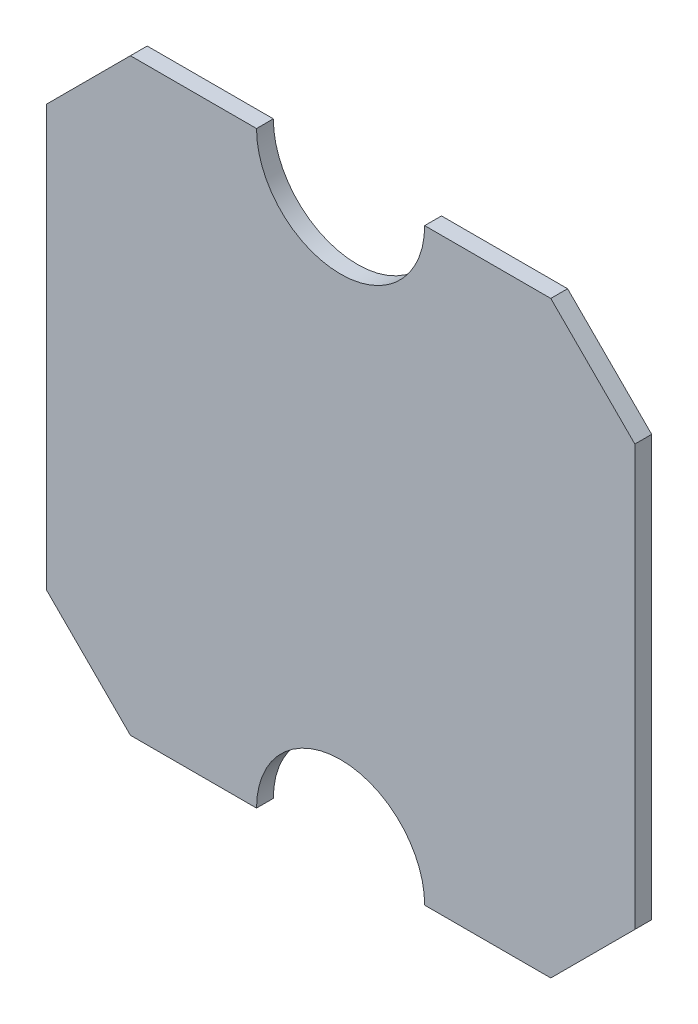
ISO-10303-21;
HEADER;
FILE_DESCRIPTION(('STEP AP214'),'2;1');
FILE_NAME('part.step','',(''),(''),'','','');
FILE_SCHEMA(('AUTOMOTIVE_DESIGN { 1 0 10303 214 1 1 1 1 }'));
ENDSEC;
DATA;
#1=APPLICATION_CONTEXT('core data for automotive mechanical design processes');
#2=APPLICATION_PROTOCOL_DEFINITION('international standard','automotive_design',2000,#1);
#3=PRODUCT_CONTEXT('',#1,'mechanical');
#4=PRODUCT('Part','Part','',(#3));
#5=PRODUCT_RELATED_PRODUCT_CATEGORY('part','',(#4));
#6=PRODUCT_DEFINITION_FORMATION('','',#4);
#7=PRODUCT_DEFINITION_CONTEXT('part definition',#1,'design');
#8=PRODUCT_DEFINITION('design','',#6,#7);
#9=PRODUCT_DEFINITION_SHAPE('','',#8);
#10=(LENGTH_UNIT() NAMED_UNIT(*) SI_UNIT(.MILLI.,.METRE.));
#11=(NAMED_UNIT(*) PLANE_ANGLE_UNIT() SI_UNIT($,.RADIAN.));
#12=(NAMED_UNIT(*) SI_UNIT($,.STERADIAN.) SOLID_ANGLE_UNIT());
#13=UNCERTAINTY_MEASURE_WITH_UNIT(LENGTH_MEASURE(1.E-05),#10,'distance_accuracy_value','');
#14=(GEOMETRIC_REPRESENTATION_CONTEXT(3) GLOBAL_UNCERTAINTY_ASSIGNED_CONTEXT((#13)) GLOBAL_UNIT_ASSIGNED_CONTEXT((#10,
#11,#12)) REPRESENTATION_CONTEXT('',''));
#15=CARTESIAN_POINT('',(0.,0.,0.));
#16=DIRECTION('',(0.,0.,1.));
#17=DIRECTION('',(1.,0.,0.));
#18=AXIS2_PLACEMENT_3D('',#15,#16,#17);
#19=CARTESIAN_POINT('',(-1.17283157399439E-12,175.,10.));
#20=DIRECTION('',(0.,0.,-1.));
#21=DIRECTION('',(-1.,0.,0.));
#22=AXIS2_PLACEMENT_3D('',#19,#20,#21);
#23=CYLINDRICAL_SURFACE('',#22,50.);
#24=CARTESIAN_POINT('',(-1.17283157399439E-12,175.,0.));
#25=DIRECTION('',(0.,0.,1.));
#26=DIRECTION('',(1.,0.,0.));
#27=AXIS2_PLACEMENT_3D('',#24,#25,#26);
#28=CIRCLE('',#27,50.);
#29=CARTESIAN_POINT('',(-50.0000000000012,175.,0.));
#30=VERTEX_POINT('',#29);
#31=CARTESIAN_POINT('',(49.9999999999989,175.,0.));
#32=VERTEX_POINT('',#31);
#33=EDGE_CURVE('E170',#30,#32,#28,.T.);
#34=ORIENTED_EDGE('',*,*,#33,.F.);
#35=DIRECTION('',(0.,0.,-1.));
#36=VECTOR('',#35,1.);
#37=CARTESIAN_POINT('',(-50.0000000000012,175.,10.));
#38=LINE('',#37,#36);
#39=CARTESIAN_POINT('',(-50.0000000000012,175.,10.));
#40=VERTEX_POINT('',#39);
#41=EDGE_CURVE('E11',#40,#30,#38,.T.);
#42=ORIENTED_EDGE('',*,*,#41,.F.);
#43=CARTESIAN_POINT('',(-1.17283157399439E-12,175.,10.));
#44=DIRECTION('',(0.,0.,1.));
#45=DIRECTION('',(1.,0.,0.));
#46=AXIS2_PLACEMENT_3D('',#43,#44,#45);
#47=CIRCLE('',#46,50.);
#48=CARTESIAN_POINT('',(49.9999999999989,175.,10.));
#49=VERTEX_POINT('',#48);
#50=EDGE_CURVE('E258',#40,#49,#47,.T.);
#51=ORIENTED_EDGE('',*,*,#50,.T.);
#52=DIRECTION('',(0.,0.,-1.));
#53=VECTOR('',#52,1.);
#54=CARTESIAN_POINT('',(49.9999999999989,175.,10.));
#55=LINE('',#54,#53);
#56=EDGE_CURVE('E111',#49,#32,#55,.T.);
#57=ORIENTED_EDGE('',*,*,#56,.T.);
#58=EDGE_LOOP('',(#34,#42,#51,#57));
#59=FACE_BOUND('',#58,.T.);
#60=ADVANCED_FACE('F47',(#59),#23,.F.);
#61=CARTESIAN_POINT('',(0.,175.,10.));
#62=DIRECTION('',(0.,-1.,0.));
#63=DIRECTION('',(1.,0.,0.));
#64=AXIS2_PLACEMENT_3D('',#61,#62,#63);
#65=PLANE('',#64);
#66=DIRECTION('',(-1.,0.,0.));
#67=VECTOR('',#66,1.);
#68=CARTESIAN_POINT('',(0.,175.,0.));
#69=LINE('',#68,#67);
#70=CARTESIAN_POINT('',(-125.,175.,0.));
#71=VERTEX_POINT('',#70);
#72=EDGE_CURVE('E174',#30,#71,#69,.T.);
#73=ORIENTED_EDGE('',*,*,#72,.T.);
#74=DIRECTION('',(0.,0.,-1.));
#75=VECTOR('',#74,1.);
#76=CARTESIAN_POINT('',(-125.,175.,10.));
#77=LINE('',#76,#75);
#78=CARTESIAN_POINT('',(-125.,175.,10.));
#79=VERTEX_POINT('',#78);
#80=EDGE_CURVE('E56',#79,#71,#77,.T.);
#81=ORIENTED_EDGE('',*,*,#80,.F.);
#82=DIRECTION('',(-1.,0.,0.));
#83=VECTOR('',#82,1.);
#84=CARTESIAN_POINT('',(0.,175.,10.));
#85=LINE('',#84,#83);
#86=EDGE_CURVE('E167',#40,#79,#85,.T.);
#87=ORIENTED_EDGE('',*,*,#86,.F.);
#88=ORIENTED_EDGE('',*,*,#41,.T.);
#89=EDGE_LOOP('',(#73,#81,#87,#88));
#90=FACE_BOUND('',#89,.T.);
#91=ADVANCED_FACE('F241',(#90),#65,.F.);
#92=CARTESIAN_POINT('',(-150.,150.,10.));
#93=DIRECTION('',(-0.707106781186548,0.707106781186547,0.));
#94=DIRECTION('',(-0.707106781186547,-0.707106781186548,0.));
#95=AXIS2_PLACEMENT_3D('',#92,#93,#94);
#96=PLANE('',#95);
#97=DIRECTION('',(0.707106781186547,0.707106781186548,0.));
#98=VECTOR('',#97,1.);
#99=CARTESIAN_POINT('',(-150.,150.,0.));
#100=LINE('',#99,#98);
#101=CARTESIAN_POINT('',(-175.,125.,0.));
#102=VERTEX_POINT('',#101);
#103=EDGE_CURVE('E178',#102,#71,#100,.T.);
#104=ORIENTED_EDGE('',*,*,#103,.F.);
#105=DIRECTION('',(0.,0.,-1.));
#106=VECTOR('',#105,1.);
#107=CARTESIAN_POINT('',(-175.,125.,10.));
#108=LINE('',#107,#106);
#109=CARTESIAN_POINT('',(-175.,125.,10.));
#110=VERTEX_POINT('',#109);
#111=EDGE_CURVE('E229',#110,#102,#108,.T.);
#112=ORIENTED_EDGE('',*,*,#111,.F.);
#113=DIRECTION('',(0.707106781186547,0.707106781186548,0.));
#114=VECTOR('',#113,1.);
#115=CARTESIAN_POINT('',(-150.,150.,10.));
#116=LINE('',#115,#114);
#117=EDGE_CURVE('E238',#110,#79,#116,.T.);
#118=ORIENTED_EDGE('',*,*,#117,.T.);
#119=ORIENTED_EDGE('',*,*,#80,.T.);
#120=EDGE_LOOP('',(#104,#112,#118,#119));
#121=FACE_BOUND('',#120,.T.);
#122=ADVANCED_FACE('F236',(#121),#96,.T.);
#123=CARTESIAN_POINT('',(-175.,0.,10.));
#124=DIRECTION('',(-1.,0.,0.));
#125=DIRECTION('',(0.,0.,1.));
#126=AXIS2_PLACEMENT_3D('',#123,#124,#125);
#127=PLANE('',#126);
#128=DIRECTION('',(0.,1.,0.));
#129=VECTOR('',#128,1.);
#130=CARTESIAN_POINT('',(-175.,0.,0.));
#131=LINE('',#130,#129);
#132=CARTESIAN_POINT('',(-175.,-125.,0.));
#133=VERTEX_POINT('',#132);
#134=EDGE_CURVE('E183',#133,#102,#131,.T.);
#135=ORIENTED_EDGE('',*,*,#134,.F.);
#136=DIRECTION('',(0.,0.,-1.));
#137=VECTOR('',#136,1.);
#138=CARTESIAN_POINT('',(-175.,-125.,10.));
#139=LINE('',#138,#137);
#140=CARTESIAN_POINT('',(-175.,-125.,10.));
#141=VERTEX_POINT('',#140);
#142=EDGE_CURVE('E226',#141,#133,#139,.T.);
#143=ORIENTED_EDGE('',*,*,#142,.F.);
#144=DIRECTION('',(0.,1.,0.));
#145=VECTOR('',#144,1.);
#146=CARTESIAN_POINT('',(-175.,0.,10.));
#147=LINE('',#146,#145);
#148=EDGE_CURVE('E251',#141,#110,#147,.T.);
#149=ORIENTED_EDGE('',*,*,#148,.T.);
#150=ORIENTED_EDGE('',*,*,#111,.T.);
#151=EDGE_LOOP('',(#135,#143,#149,#150));
#152=FACE_BOUND('',#151,.T.);
#153=ADVANCED_FACE('F247',(#152),#127,.T.);
#154=CARTESIAN_POINT('',(-150.,-150.,10.));
#155=DIRECTION('',(0.707106781186548,0.707106781186547,0.));
#156=DIRECTION('',(-0.707106781186547,0.707106781186548,0.));
#157=AXIS2_PLACEMENT_3D('',#154,#155,#156);
#158=PLANE('',#157);
#159=DIRECTION('',(0.707106781186547,-0.707106781186548,0.));
#160=VECTOR('',#159,1.);
#161=CARTESIAN_POINT('',(-150.,-150.,0.));
#162=LINE('',#161,#160);
#163=CARTESIAN_POINT('',(-125.,-175.,0.));
#164=VERTEX_POINT('',#163);
#165=EDGE_CURVE('E187',#133,#164,#162,.T.);
#166=ORIENTED_EDGE('',*,*,#165,.T.);
#167=DIRECTION('',(0.,0.,-1.));
#168=VECTOR('',#167,1.);
#169=CARTESIAN_POINT('',(-125.,-175.,10.));
#170=LINE('',#169,#168);
#171=CARTESIAN_POINT('',(-125.,-175.,10.));
#172=VERTEX_POINT('',#171);
#173=EDGE_CURVE('E223',#172,#164,#170,.T.);
#174=ORIENTED_EDGE('',*,*,#173,.F.);
#175=DIRECTION('',(0.707106781186547,-0.707106781186548,0.));
#176=VECTOR('',#175,1.);
#177=CARTESIAN_POINT('',(-150.,-150.,10.));
#178=LINE('',#177,#176);
#179=EDGE_CURVE('E256',#141,#172,#178,.T.);
#180=ORIENTED_EDGE('',*,*,#179,.F.);
#181=ORIENTED_EDGE('',*,*,#142,.T.);
#182=EDGE_LOOP('',(#166,#174,#180,#181));
#183=FACE_BOUND('',#182,.T.);
#184=ADVANCED_FACE('F321',(#183),#158,.F.);
#185=CARTESIAN_POINT('',(0.,-175.,10.));
#186=DIRECTION('',(0.,-1.,0.));
#187=DIRECTION('',(1.,0.,0.));
#188=AXIS2_PLACEMENT_3D('',#185,#186,#187);
#189=PLANE('',#188);
#190=DIRECTION('',(-1.,0.,0.));
#191=VECTOR('',#190,1.);
#192=CARTESIAN_POINT('',(0.,-175.,0.));
#193=LINE('',#192,#191);
#194=CARTESIAN_POINT('',(-50.,-175.,0.));
#195=VERTEX_POINT('',#194);
#196=EDGE_CURVE('E191',#195,#164,#193,.T.);
#197=ORIENTED_EDGE('',*,*,#196,.F.);
#198=DIRECTION('',(0.,0.,-1.));
#199=VECTOR('',#198,1.);
#200=CARTESIAN_POINT('',(-50.,-175.,10.));
#201=LINE('',#200,#199);
#202=CARTESIAN_POINT('',(-50.,-175.,10.));
#203=VERTEX_POINT('',#202);
#204=EDGE_CURVE('E220',#203,#195,#201,.T.);
#205=ORIENTED_EDGE('',*,*,#204,.F.);
#206=DIRECTION('',(-1.,0.,0.));
#207=VECTOR('',#206,1.);
#208=CARTESIAN_POINT('',(0.,-175.,10.));
#209=LINE('',#208,#207);
#210=EDGE_CURVE('E263',#203,#172,#209,.T.);
#211=ORIENTED_EDGE('',*,*,#210,.T.);
#212=ORIENTED_EDGE('',*,*,#173,.T.);
#213=EDGE_LOOP('',(#197,#205,#211,#212));
#214=FACE_BOUND('',#213,.T.);
#215=ADVANCED_FACE('F317',(#214),#189,.T.);
#216=CARTESIAN_POINT('',(0.,-175.,10.));
#217=DIRECTION('',(0.,0.,-1.));
#218=DIRECTION('',(-1.,0.,0.));
#219=AXIS2_PLACEMENT_3D('',#216,#217,#218);
#220=CYLINDRICAL_SURFACE('',#219,50.);
#221=CARTESIAN_POINT('',(0.,-175.,0.));
#222=DIRECTION('',(0.,0.,1.));
#223=DIRECTION('',(1.,0.,0.));
#224=AXIS2_PLACEMENT_3D('',#221,#222,#223);
#225=CIRCLE('',#224,50.);
#226=CARTESIAN_POINT('',(50.0000000000001,-175.,0.));
#227=VERTEX_POINT('',#226);
#228=EDGE_CURVE('E195',#195,#227,#225,.F.);
#229=ORIENTED_EDGE('',*,*,#228,.T.);
#230=DIRECTION('',(0.,0.,-1.));
#231=VECTOR('',#230,1.);
#232=CARTESIAN_POINT('',(50.0000000000001,-175.,10.));
#233=LINE('',#232,#231);
#234=CARTESIAN_POINT('',(50.0000000000001,-175.,10.));
#235=VERTEX_POINT('',#234);
#236=EDGE_CURVE('E217',#235,#227,#233,.T.);
#237=ORIENTED_EDGE('',*,*,#236,.F.);
#238=CARTESIAN_POINT('',(0.,-175.,10.));
#239=DIRECTION('',(0.,0.,1.));
#240=DIRECTION('',(1.,0.,0.));
#241=AXIS2_PLACEMENT_3D('',#238,#239,#240);
#242=CIRCLE('',#241,50.);
#243=EDGE_CURVE('E267',#203,#235,#242,.F.);
#244=ORIENTED_EDGE('',*,*,#243,.F.);
#245=ORIENTED_EDGE('',*,*,#204,.T.);
#246=EDGE_LOOP('',(#229,#237,#244,#245));
#247=FACE_BOUND('',#246,.T.);
#248=ADVANCED_FACE('F281',(#247),#220,.F.);
#249=CARTESIAN_POINT('',(124.999999999999,-175.,0.));
#250=VERTEX_POINT('',#249);
#251=EDGE_CURVE('E196',#250,#227,#193,.T.);
#252=ORIENTED_EDGE('',*,*,#251,.F.);
#253=DIRECTION('',(0.,0.,-1.));
#254=VECTOR('',#253,1.);
#255=CARTESIAN_POINT('',(124.999999999999,-175.,10.));
#256=LINE('',#255,#254);
#257=CARTESIAN_POINT('',(124.999999999999,-175.,10.));
#258=VERTEX_POINT('',#257);
#259=EDGE_CURVE('E214',#258,#250,#256,.T.);
#260=ORIENTED_EDGE('',*,*,#259,.F.);
#261=EDGE_CURVE('E268',#258,#235,#209,.T.);
#262=ORIENTED_EDGE('',*,*,#261,.T.);
#263=ORIENTED_EDGE('',*,*,#236,.T.);
#264=EDGE_LOOP('',(#252,#260,#262,#263));
#265=FACE_BOUND('',#264,.T.);
#266=ADVANCED_FACE('F276',(#265),#189,.T.);
#267=CARTESIAN_POINT('',(150.,-149.999999999998,10.));
#268=DIRECTION('',(0.707106781186553,-0.707106781186543,0.));
#269=DIRECTION('',(0.707106781186543,0.707106781186553,0.));
#270=AXIS2_PLACEMENT_3D('',#267,#268,#269);
#271=PLANE('',#270);
#272=DIRECTION('',(-0.707106781186543,-0.707106781186553,0.));
#273=VECTOR('',#272,1.);
#274=CARTESIAN_POINT('',(150.,-149.999999999998,0.));
#275=LINE('',#274,#273);
#276=CARTESIAN_POINT('',(175.,-124.999999999998,0.));
#277=VERTEX_POINT('',#276);
#278=EDGE_CURVE('E200',#277,#250,#275,.T.);
#279=ORIENTED_EDGE('',*,*,#278,.F.);
#280=DIRECTION('',(0.,0.,-1.));
#281=VECTOR('',#280,1.);
#282=CARTESIAN_POINT('',(175.,-124.999999999998,10.));
#283=LINE('',#282,#281);
#284=CARTESIAN_POINT('',(175.,-124.999999999998,10.));
#285=VERTEX_POINT('',#284);
#286=EDGE_CURVE('E159',#285,#277,#283,.T.);
#287=ORIENTED_EDGE('',*,*,#286,.F.);
#288=DIRECTION('',(-0.707106781186543,-0.707106781186553,0.));
#289=VECTOR('',#288,1.);
#290=CARTESIAN_POINT('',(150.,-149.999999999998,10.));
#291=LINE('',#290,#289);
#292=EDGE_CURVE('E150',#285,#258,#291,.T.);
#293=ORIENTED_EDGE('',*,*,#292,.T.);
#294=ORIENTED_EDGE('',*,*,#259,.T.);
#295=EDGE_LOOP('',(#279,#287,#293,#294));
#296=FACE_BOUND('',#295,.T.);
#297=ADVANCED_FACE('F308',(#296),#271,.T.);
#298=CARTESIAN_POINT('',(175.,0.,10.));
#299=DIRECTION('',(-1.,0.,0.));
#300=DIRECTION('',(0.,0.,1.));
#301=AXIS2_PLACEMENT_3D('',#298,#299,#300);
#302=PLANE('',#301);
#303=DIRECTION('',(0.,1.,0.));
#304=VECTOR('',#303,1.);
#305=CARTESIAN_POINT('',(175.,0.,0.));
#306=LINE('',#305,#304);
#307=CARTESIAN_POINT('',(175.,124.999999999998,0.));
#308=VERTEX_POINT('',#307);
#309=EDGE_CURVE('E157',#277,#308,#306,.T.);
#310=ORIENTED_EDGE('',*,*,#309,.T.);
#311=DIRECTION('',(0.,0.,-1.));
#312=VECTOR('',#311,1.);
#313=CARTESIAN_POINT('',(175.,124.999999999998,10.));
#314=LINE('',#313,#312);
#315=CARTESIAN_POINT('',(175.,124.999999999998,10.));
#316=VERTEX_POINT('',#315);
#317=EDGE_CURVE('E154',#316,#308,#314,.T.);
#318=ORIENTED_EDGE('',*,*,#317,.F.);
#319=DIRECTION('',(0.,1.,0.));
#320=VECTOR('',#319,1.);
#321=CARTESIAN_POINT('',(175.,0.,10.));
#322=LINE('',#321,#320);
#323=EDGE_CURVE('E143',#285,#316,#322,.T.);
#324=ORIENTED_EDGE('',*,*,#323,.F.);
#325=ORIENTED_EDGE('',*,*,#286,.T.);
#326=EDGE_LOOP('',(#310,#318,#324,#325));
#327=FACE_BOUND('',#326,.T.);
#328=ADVANCED_FACE('F155',(#327),#302,.F.);
#329=CARTESIAN_POINT('',(150.,149.999999999998,10.));
#330=DIRECTION('',(-0.707106781186553,-0.707106781186543,0.));
#331=DIRECTION('',(0.707106781186543,-0.707106781186553,0.));
#332=AXIS2_PLACEMENT_3D('',#329,#330,#331);
#333=PLANE('',#332);
#334=DIRECTION('',(-0.707106781186543,0.707106781186553,0.));
#335=VECTOR('',#334,1.);
#336=CARTESIAN_POINT('',(150.,149.999999999998,0.));
#337=LINE('',#336,#335);
#338=CARTESIAN_POINT('',(124.999999999999,175.,0.));
#339=VERTEX_POINT('',#338);
#340=EDGE_CURVE('E104',#308,#339,#337,.T.);
#341=ORIENTED_EDGE('',*,*,#340,.T.);
#342=DIRECTION('',(0.,0.,-1.));
#343=VECTOR('',#342,1.);
#344=CARTESIAN_POINT('',(124.999999999999,175.,10.));
#345=LINE('',#344,#343);
#346=CARTESIAN_POINT('',(124.999999999999,175.,10.));
#347=VERTEX_POINT('',#346);
#348=EDGE_CURVE('E160',#347,#339,#345,.T.);
#349=ORIENTED_EDGE('',*,*,#348,.F.);
#350=DIRECTION('',(-0.707106781186543,0.707106781186553,0.));
#351=VECTOR('',#350,1.);
#352=CARTESIAN_POINT('',(150.,149.999999999998,10.));
#353=LINE('',#352,#351);
#354=EDGE_CURVE('E147',#316,#347,#353,.T.);
#355=ORIENTED_EDGE('',*,*,#354,.F.);
#356=ORIENTED_EDGE('',*,*,#317,.T.);
#357=EDGE_LOOP('',(#341,#349,#355,#356));
#358=FACE_BOUND('',#357,.T.);
#359=ADVANCED_FACE('F162',(#358),#333,.F.);
#360=EDGE_CURVE('E179',#339,#32,#69,.T.);
#361=ORIENTED_EDGE('',*,*,#360,.T.);
#362=ORIENTED_EDGE('',*,*,#56,.F.);
#363=EDGE_CURVE('E64',#347,#49,#85,.T.);
#364=ORIENTED_EDGE('',*,*,#363,.F.);
#365=ORIENTED_EDGE('',*,*,#348,.T.);
#366=EDGE_LOOP('',(#361,#362,#364,#365));
#367=FACE_BOUND('',#366,.T.);
#368=ADVANCED_FACE('F294',(#367),#65,.F.);
#369=CARTESIAN_POINT('',(0.,0.,10.));
#370=DIRECTION('',(0.,0.,1.));
#371=DIRECTION('',(1.,0.,0.));
#372=AXIS2_PLACEMENT_3D('',#369,#370,#371);
#373=PLANE('',#372);
#374=ORIENTED_EDGE('',*,*,#50,.F.);
#375=ORIENTED_EDGE('',*,*,#86,.T.);
#376=ORIENTED_EDGE('',*,*,#117,.F.);
#377=ORIENTED_EDGE('',*,*,#148,.F.);
#378=ORIENTED_EDGE('',*,*,#179,.T.);
#379=ORIENTED_EDGE('',*,*,#210,.F.);
#380=ORIENTED_EDGE('',*,*,#243,.T.);
#381=ORIENTED_EDGE('',*,*,#261,.F.);
#382=ORIENTED_EDGE('',*,*,#292,.F.);
#383=ORIENTED_EDGE('',*,*,#323,.T.);
#384=ORIENTED_EDGE('',*,*,#354,.T.);
#385=ORIENTED_EDGE('',*,*,#363,.T.);
#386=EDGE_LOOP('',(#374,#375,#376,#377,#378,#379,#380,#381,#382,#383,#384,#385));
#387=FACE_BOUND('',#386,.T.);
#388=ADVANCED_FACE('F145',(#387),#373,.T.);
#389=CARTESIAN_POINT('',(0.,0.,0.));
#390=DIRECTION('',(0.,0.,1.));
#391=DIRECTION('',(1.,0.,0.));
#392=AXIS2_PLACEMENT_3D('',#389,#390,#391);
#393=PLANE('',#392);
#394=ORIENTED_EDGE('',*,*,#33,.T.);
#395=ORIENTED_EDGE('',*,*,#360,.F.);
#396=ORIENTED_EDGE('',*,*,#340,.F.);
#397=ORIENTED_EDGE('',*,*,#309,.F.);
#398=ORIENTED_EDGE('',*,*,#278,.T.);
#399=ORIENTED_EDGE('',*,*,#251,.T.);
#400=ORIENTED_EDGE('',*,*,#228,.F.);
#401=ORIENTED_EDGE('',*,*,#196,.T.);
#402=ORIENTED_EDGE('',*,*,#165,.F.);
#403=ORIENTED_EDGE('',*,*,#134,.T.);
#404=ORIENTED_EDGE('',*,*,#103,.T.);
#405=ORIENTED_EDGE('',*,*,#72,.F.);
#406=EDGE_LOOP('',(#394,#395,#396,#397,#398,#399,#400,#401,#402,#403,#404,#405));
#407=FACE_BOUND('',#406,.T.);
#408=ADVANCED_FACE('F243',(#407),#393,.F.);
#409=CLOSED_SHELL('',(#60,#91,#122,#153,#184,#215,#248,#266,#297,#328,#359,#368,#388,#408));
#410=MANIFOLD_SOLID_BREP('B2',#409);
#411=ADVANCED_BREP_SHAPE_REPRESENTATION('',(#18,#410),#14);
#412=SHAPE_DEFINITION_REPRESENTATION(#9,#411);
ENDSEC;
END-ISO-10303-21;
